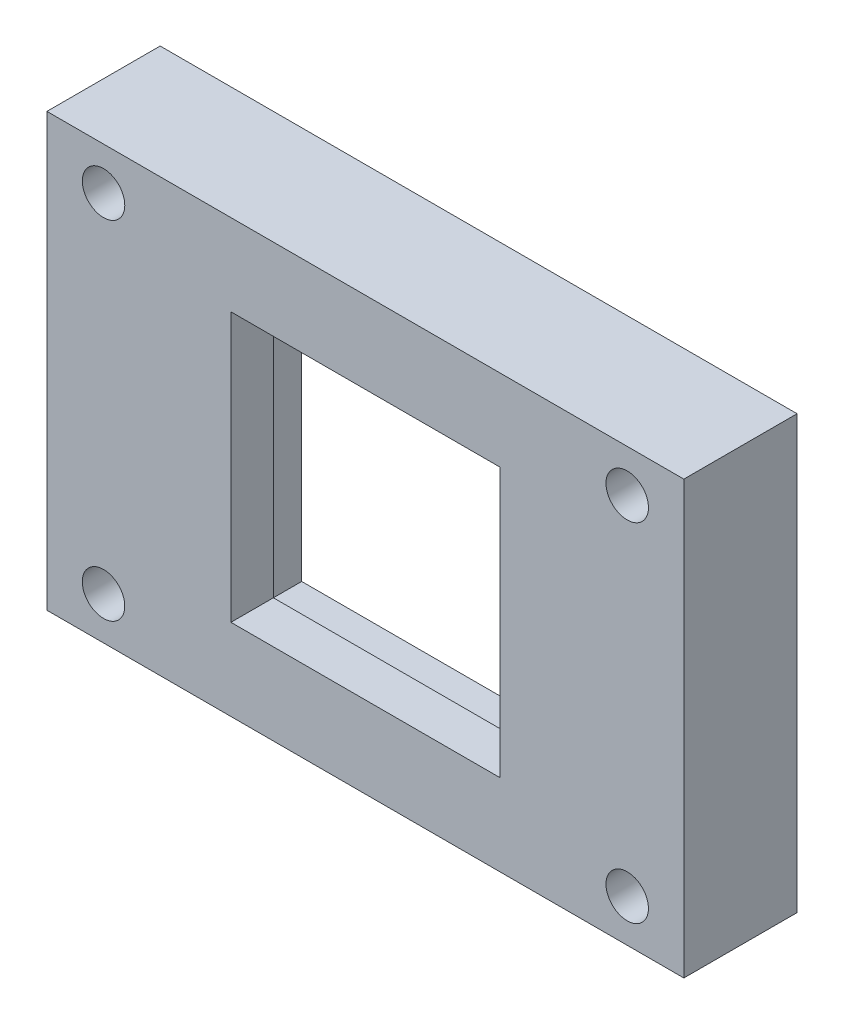
ISO-10303-21;
HEADER;
FILE_DESCRIPTION(('STEP AP214'),'2;1');
FILE_NAME('part.step','',(''),(''),'','','');
FILE_SCHEMA(('AUTOMOTIVE_DESIGN { 1 0 10303 214 1 1 1 1 }'));
ENDSEC;
DATA;
#1=APPLICATION_CONTEXT('core data for automotive mechanical design processes');
#2=APPLICATION_PROTOCOL_DEFINITION('international standard','automotive_design',2000,#1);
#3=PRODUCT_CONTEXT('',#1,'mechanical');
#4=PRODUCT('Part','Part','',(#3));
#5=PRODUCT_RELATED_PRODUCT_CATEGORY('part','',(#4));
#6=PRODUCT_DEFINITION_FORMATION('','',#4);
#7=PRODUCT_DEFINITION_CONTEXT('part definition',#1,'design');
#8=PRODUCT_DEFINITION('design','',#6,#7);
#9=PRODUCT_DEFINITION_SHAPE('','',#8);
#10=(LENGTH_UNIT() NAMED_UNIT(*) SI_UNIT(.MILLI.,.METRE.));
#11=(NAMED_UNIT(*) PLANE_ANGLE_UNIT() SI_UNIT($,.RADIAN.));
#12=(NAMED_UNIT(*) SI_UNIT($,.STERADIAN.) SOLID_ANGLE_UNIT());
#13=UNCERTAINTY_MEASURE_WITH_UNIT(LENGTH_MEASURE(1.E-05),#10,'distance_accuracy_value','');
#14=(GEOMETRIC_REPRESENTATION_CONTEXT(3) GLOBAL_UNCERTAINTY_ASSIGNED_CONTEXT((#13)) GLOBAL_UNIT_ASSIGNED_CONTEXT((#10,
#11,#12)) REPRESENTATION_CONTEXT('',''));
#15=CARTESIAN_POINT('',(0.,0.,0.));
#16=DIRECTION('',(0.,0.,1.));
#17=DIRECTION('',(1.,0.,0.));
#18=AXIS2_PLACEMENT_3D('',#15,#16,#17);
#19=CARTESIAN_POINT('',(35.,27.7635926596247,10.));
#20=DIRECTION('',(0.,-1.,0.));
#21=DIRECTION('',(0.,0.,-1.));
#22=AXIS2_PLACEMENT_3D('',#19,#20,#21);
#23=PLANE('',#22);
#24=DIRECTION('',(0.,0.,-1.));
#25=VECTOR('',#24,1.);
#26=CARTESIAN_POINT('',(35.,27.7635926596247,10.));
#27=LINE('',#26,#25);
#28=CARTESIAN_POINT('',(35.,27.7635926596247,5.));
#29=VERTEX_POINT('',#28);
#30=CARTESIAN_POINT('',(35.,27.7635926596247,0.));
#31=VERTEX_POINT('',#30);
#32=EDGE_CURVE('E159',#29,#31,#27,.T.);
#33=ORIENTED_EDGE('',*,*,#32,.F.);
#34=DIRECTION('',(-1.,0.,0.));
#35=VECTOR('',#34,1.);
#36=CARTESIAN_POINT('',(13.,27.7635926596247,5.));
#37=LINE('',#36,#35);
#38=CARTESIAN_POINT('',(10.,27.7635926596247,5.));
#39=VERTEX_POINT('',#38);
#40=EDGE_CURVE('E173',#29,#39,#37,.T.);
#41=ORIENTED_EDGE('',*,*,#40,.T.);
#42=DIRECTION('',(0.,0.,-1.));
#43=VECTOR('',#42,1.);
#44=CARTESIAN_POINT('',(10.,27.7635926596247,10.));
#45=LINE('',#44,#43);
#46=CARTESIAN_POINT('',(10.,27.7635926596247,0.));
#47=VERTEX_POINT('',#46);
#48=EDGE_CURVE('E153',#39,#47,#45,.T.);
#49=ORIENTED_EDGE('',*,*,#48,.T.);
#50=DIRECTION('',(-1.,0.,0.));
#51=VECTOR('',#50,1.);
#52=CARTESIAN_POINT('',(35.,27.7635926596247,0.));
#53=LINE('',#52,#51);
#54=EDGE_CURVE('E170',#31,#47,#53,.T.);
#55=ORIENTED_EDGE('',*,*,#54,.F.);
#56=EDGE_LOOP('',(#33,#41,#49,#55));
#57=FACE_BOUND('',#56,.T.);
#58=ADVANCED_FACE('F33',(#57),#23,.T.);
#59=CARTESIAN_POINT('',(10.,2.76359265962468,10.));
#60=DIRECTION('',(0.,1.,0.));
#61=DIRECTION('',(0.,0.,1.));
#62=AXIS2_PLACEMENT_3D('',#59,#60,#61);
#63=PLANE('',#62);
#64=DIRECTION('',(-1.,0.,0.));
#65=VECTOR('',#64,1.);
#66=CARTESIAN_POINT('',(13.,2.76359265962468,5.));
#67=LINE('',#66,#65);
#68=CARTESIAN_POINT('',(35.,2.76359265962468,5.));
#69=VERTEX_POINT('',#68);
#70=CARTESIAN_POINT('',(10.,2.76359265962468,5.));
#71=VERTEX_POINT('',#70);
#72=EDGE_CURVE('E175',#69,#71,#67,.T.);
#73=ORIENTED_EDGE('',*,*,#72,.F.);
#74=DIRECTION('',(0.,0.,-1.));
#75=VECTOR('',#74,1.);
#76=CARTESIAN_POINT('',(35.,2.76359265962468,10.));
#77=LINE('',#76,#75);
#78=CARTESIAN_POINT('',(35.,2.76359265962468,0.));
#79=VERTEX_POINT('',#78);
#80=EDGE_CURVE('E157',#69,#79,#77,.T.);
#81=ORIENTED_EDGE('',*,*,#80,.T.);
#82=DIRECTION('',(1.,0.,0.));
#83=VECTOR('',#82,1.);
#84=CARTESIAN_POINT('',(10.,2.76359265962468,0.));
#85=LINE('',#84,#83);
#86=CARTESIAN_POINT('',(10.,2.76359265962468,0.));
#87=VERTEX_POINT('',#86);
#88=EDGE_CURVE('E164',#87,#79,#85,.T.);
#89=ORIENTED_EDGE('',*,*,#88,.F.);
#90=DIRECTION('',(0.,0.,-1.));
#91=VECTOR('',#90,1.);
#92=CARTESIAN_POINT('',(10.,2.76359265962468,10.));
#93=LINE('',#92,#91);
#94=EDGE_CURVE('E155',#71,#87,#93,.T.);
#95=ORIENTED_EDGE('',*,*,#94,.F.);
#96=EDGE_LOOP('',(#73,#81,#89,#95));
#97=FACE_BOUND('',#96,.T.);
#98=ADVANCED_FACE('F279',(#97),#63,.T.);
#99=CARTESIAN_POINT('',(35.,2.76359265962468,10.));
#100=DIRECTION('',(-1.,0.,0.));
#101=DIRECTION('',(0.,-1.,0.));
#102=AXIS2_PLACEMENT_3D('',#99,#100,#101);
#103=PLANE('',#102);
#104=ORIENTED_EDGE('',*,*,#80,.F.);
#105=DIRECTION('',(0.,-1.,0.));
#106=VECTOR('',#105,1.);
#107=CARTESIAN_POINT('',(35.,0.,5.));
#108=LINE('',#107,#106);
#109=EDGE_CURVE('E184',#29,#69,#108,.T.);
#110=ORIENTED_EDGE('',*,*,#109,.F.);
#111=ORIENTED_EDGE('',*,*,#32,.T.);
#112=DIRECTION('',(0.,1.,0.));
#113=VECTOR('',#112,1.);
#114=CARTESIAN_POINT('',(35.,2.76359265962468,0.));
#115=LINE('',#114,#113);
#116=EDGE_CURVE('E161',#79,#31,#115,.T.);
#117=ORIENTED_EDGE('',*,*,#116,.F.);
#118=EDGE_LOOP('',(#104,#110,#111,#117));
#119=FACE_BOUND('',#118,.T.);
#120=ADVANCED_FACE('F261',(#119),#103,.T.);
#121=CARTESIAN_POINT('',(0.,0.,0.));
#122=DIRECTION('',(0.,0.,1.));
#123=DIRECTION('',(1.,0.,0.));
#124=AXIS2_PLACEMENT_3D('',#121,#122,#123);
#125=PLANE('',#124);
#126=CARTESIAN_POINT('',(4.,3.00000000000001,0.));
#127=DIRECTION('',(0.,0.,1.));
#128=DIRECTION('',(-1.,0.,0.));
#129=AXIS2_PLACEMENT_3D('',#126,#127,#128);
#130=CIRCLE('',#129,1.5);
#131=CARTESIAN_POINT('',(2.5,3.00000000000001,0.));
#132=VERTEX_POINT('',#131);
#133=EDGE_CURVE('E209',#132,#132,#130,.T.);
#134=ORIENTED_EDGE('',*,*,#133,.T.);
#135=EDGE_LOOP('',(#134));
#136=FACE_BOUND('',#135,.T.);
#137=CARTESIAN_POINT('',(41.,3.,0.));
#138=DIRECTION('',(0.,0.,1.));
#139=DIRECTION('',(-1.,0.,0.));
#140=AXIS2_PLACEMENT_3D('',#137,#138,#139);
#141=CIRCLE('',#140,1.5);
#142=CARTESIAN_POINT('',(39.5,3.,0.));
#143=VERTEX_POINT('',#142);
#144=EDGE_CURVE('E212',#143,#143,#141,.T.);
#145=ORIENTED_EDGE('',*,*,#144,.T.);
#146=EDGE_LOOP('',(#145));
#147=FACE_BOUND('',#146,.T.);
#148=CARTESIAN_POINT('',(41.,27.5271853192494,0.));
#149=DIRECTION('',(0.,0.,1.));
#150=DIRECTION('',(1.,0.,0.));
#151=AXIS2_PLACEMENT_3D('',#148,#149,#150);
#152=CIRCLE('',#151,1.5);
#153=CARTESIAN_POINT('',(42.5,27.5271853192494,0.));
#154=VERTEX_POINT('',#153);
#155=EDGE_CURVE('E208',#154,#154,#152,.T.);
#156=ORIENTED_EDGE('',*,*,#155,.T.);
#157=EDGE_LOOP('',(#156));
#158=FACE_BOUND('',#157,.T.);
#159=CARTESIAN_POINT('',(4.,27.5271853192494,0.));
#160=DIRECTION('',(0.,0.,1.));
#161=DIRECTION('',(1.,0.,0.));
#162=AXIS2_PLACEMENT_3D('',#159,#160,#161);
#163=CIRCLE('',#162,1.5);
#164=CARTESIAN_POINT('',(5.5,27.5271853192494,0.));
#165=VERTEX_POINT('',#164);
#166=EDGE_CURVE('E205',#165,#165,#163,.T.);
#167=ORIENTED_EDGE('',*,*,#166,.T.);
#168=EDGE_LOOP('',(#167));
#169=FACE_BOUND('',#168,.T.);
#170=DIRECTION('',(-1.,0.,0.));
#171=VECTOR('',#170,1.);
#172=CARTESIAN_POINT('',(45.0000000000001,30.5271853192494,0.));
#173=LINE('',#172,#171);
#174=CARTESIAN_POINT('',(45.0000000000001,30.5271853192494,0.));
#175=VERTEX_POINT('',#174);
#176=CARTESIAN_POINT('',(0.,30.5271853192494,0.));
#177=VERTEX_POINT('',#176);
#178=EDGE_CURVE('E150',#175,#177,#173,.T.);
#179=ORIENTED_EDGE('',*,*,#178,.F.);
#180=DIRECTION('',(0.,1.,0.));
#181=VECTOR('',#180,1.);
#182=CARTESIAN_POINT('',(45.0000000000001,0.,0.));
#183=LINE('',#182,#181);
#184=CARTESIAN_POINT('',(45.0000000000001,0.,0.));
#185=VERTEX_POINT('',#184);
#186=EDGE_CURVE('E144',#185,#175,#183,.T.);
#187=ORIENTED_EDGE('',*,*,#186,.F.);
#188=DIRECTION('',(1.,0.,0.));
#189=VECTOR('',#188,1.);
#190=CARTESIAN_POINT('',(0.,0.,0.));
#191=LINE('',#190,#189);
#192=CARTESIAN_POINT('',(0.,0.,0.));
#193=VERTEX_POINT('',#192);
#194=EDGE_CURVE('E147',#193,#185,#191,.T.);
#195=ORIENTED_EDGE('',*,*,#194,.F.);
#196=DIRECTION('',(0.,-1.,0.));
#197=VECTOR('',#196,1.);
#198=CARTESIAN_POINT('',(0.,30.5271853192494,0.));
#199=LINE('',#198,#197);
#200=EDGE_CURVE('E137',#177,#193,#199,.T.);
#201=ORIENTED_EDGE('',*,*,#200,.F.);
#202=EDGE_LOOP('',(#179,#187,#195,#201));
#203=FACE_BOUND('',#202,.T.);
#204=ORIENTED_EDGE('',*,*,#54,.T.);
#205=DIRECTION('',(0.,-1.,0.));
#206=VECTOR('',#205,1.);
#207=CARTESIAN_POINT('',(10.,27.7635926596247,0.));
#208=LINE('',#207,#206);
#209=EDGE_CURVE('E167',#47,#87,#208,.T.);
#210=ORIENTED_EDGE('',*,*,#209,.T.);
#211=ORIENTED_EDGE('',*,*,#88,.T.);
#212=ORIENTED_EDGE('',*,*,#116,.T.);
#213=EDGE_LOOP('',(#204,#210,#211,#212));
#214=FACE_BOUND('',#213,.T.);
#215=ADVANCED_FACE('F258',(#136,#147,#158,#169,#203,#214),#125,.F.);
#216=CARTESIAN_POINT('',(45.0000000000001,30.5271853192494,10.));
#217=DIRECTION('',(0.,-1.,0.));
#218=DIRECTION('',(1.,0.,0.));
#219=AXIS2_PLACEMENT_3D('',#216,#217,#218);
#220=PLANE('',#219);
#221=DIRECTION('',(0.,0.,-1.));
#222=VECTOR('',#221,1.);
#223=CARTESIAN_POINT('',(0.,30.5271853192494,10.));
#224=LINE('',#223,#222);
#225=CARTESIAN_POINT('',(0.,30.5271853192494,8.));
#226=VERTEX_POINT('',#225);
#227=EDGE_CURVE('E11',#226,#177,#224,.T.);
#228=ORIENTED_EDGE('',*,*,#227,.F.);
#229=DIRECTION('',(1.,0.,0.));
#230=VECTOR('',#229,1.);
#231=CARTESIAN_POINT('',(0.,30.5271853192494,8.));
#232=LINE('',#231,#230);
#233=CARTESIAN_POINT('',(45.0000000000001,30.5271853192494,8.));
#234=VERTEX_POINT('',#233);
#235=EDGE_CURVE('E123',#226,#234,#232,.T.);
#236=ORIENTED_EDGE('',*,*,#235,.T.);
#237=DIRECTION('',(0.,0.,-1.));
#238=VECTOR('',#237,1.);
#239=CARTESIAN_POINT('',(45.0000000000001,30.5271853192494,10.));
#240=LINE('',#239,#238);
#241=EDGE_CURVE('E140',#234,#175,#240,.T.);
#242=ORIENTED_EDGE('',*,*,#241,.T.);
#243=ORIENTED_EDGE('',*,*,#178,.T.);
#244=EDGE_LOOP('',(#228,#236,#242,#243));
#245=FACE_BOUND('',#244,.T.);
#246=ADVANCED_FACE('F35',(#245),#220,.F.);
#247=CARTESIAN_POINT('',(0.,30.5271853192494,10.));
#248=DIRECTION('',(1.,0.,0.));
#249=DIRECTION('',(0.,0.,-1.));
#250=AXIS2_PLACEMENT_3D('',#247,#248,#249);
#251=PLANE('',#250);
#252=DIRECTION('',(0.,0.,-1.));
#253=VECTOR('',#252,1.);
#254=CARTESIAN_POINT('',(0.,0.,10.));
#255=LINE('',#254,#253);
#256=CARTESIAN_POINT('',(0.,0.,8.));
#257=VERTEX_POINT('',#256);
#258=EDGE_CURVE('E42',#257,#193,#255,.T.);
#259=ORIENTED_EDGE('',*,*,#258,.F.);
#260=DIRECTION('',(0.,1.,0.));
#261=VECTOR('',#260,1.);
#262=CARTESIAN_POINT('',(0.,0.,8.));
#263=LINE('',#262,#261);
#264=EDGE_CURVE('E120',#257,#226,#263,.T.);
#265=ORIENTED_EDGE('',*,*,#264,.T.);
#266=ORIENTED_EDGE('',*,*,#227,.T.);
#267=ORIENTED_EDGE('',*,*,#200,.T.);
#268=EDGE_LOOP('',(#259,#265,#266,#267));
#269=FACE_BOUND('',#268,.T.);
#270=ADVANCED_FACE('F135',(#269),#251,.F.);
#271=CARTESIAN_POINT('',(0.,0.,10.));
#272=DIRECTION('',(0.,1.,0.));
#273=DIRECTION('',(0.,0.,1.));
#274=AXIS2_PLACEMENT_3D('',#271,#272,#273);
#275=PLANE('',#274);
#276=DIRECTION('',(0.,0.,-1.));
#277=VECTOR('',#276,1.);
#278=CARTESIAN_POINT('',(45.0000000000001,0.,10.));
#279=LINE('',#278,#277);
#280=CARTESIAN_POINT('',(45.0000000000001,0.,8.));
#281=VERTEX_POINT('',#280);
#282=EDGE_CURVE('E133',#281,#185,#279,.T.);
#283=ORIENTED_EDGE('',*,*,#282,.F.);
#284=DIRECTION('',(1.,0.,0.));
#285=VECTOR('',#284,1.);
#286=CARTESIAN_POINT('',(0.,0.,8.));
#287=LINE('',#286,#285);
#288=EDGE_CURVE('E49',#257,#281,#287,.T.);
#289=ORIENTED_EDGE('',*,*,#288,.F.);
#290=ORIENTED_EDGE('',*,*,#258,.T.);
#291=ORIENTED_EDGE('',*,*,#194,.T.);
#292=EDGE_LOOP('',(#283,#289,#290,#291));
#293=FACE_BOUND('',#292,.T.);
#294=ADVANCED_FACE('F130',(#293),#275,.F.);
#295=CARTESIAN_POINT('',(45.0000000000001,0.,10.));
#296=DIRECTION('',(-1.,0.,0.));
#297=DIRECTION('',(0.,-1.,0.));
#298=AXIS2_PLACEMENT_3D('',#295,#296,#297);
#299=PLANE('',#298);
#300=ORIENTED_EDGE('',*,*,#241,.F.);
#301=DIRECTION('',(0.,-1.,0.));
#302=VECTOR('',#301,1.);
#303=CARTESIAN_POINT('',(45.0000000000001,0.,8.));
#304=LINE('',#303,#302);
#305=EDGE_CURVE('E213',#234,#281,#304,.T.);
#306=ORIENTED_EDGE('',*,*,#305,.T.);
#307=ORIENTED_EDGE('',*,*,#282,.T.);
#308=ORIENTED_EDGE('',*,*,#186,.T.);
#309=EDGE_LOOP('',(#300,#306,#307,#308));
#310=FACE_BOUND('',#309,.T.);
#311=ADVANCED_FACE('F325',(#310),#299,.F.);
#312=CARTESIAN_POINT('',(10.,27.7635926596247,10.));
#313=DIRECTION('',(1.,0.,0.));
#314=DIRECTION('',(0.,0.,-1.));
#315=AXIS2_PLACEMENT_3D('',#312,#313,#314);
#316=PLANE('',#315);
#317=DIRECTION('',(0.,-1.,0.));
#318=VECTOR('',#317,1.);
#319=CARTESIAN_POINT('',(10.,0.,4.99999999999999));
#320=LINE('',#319,#318);
#321=EDGE_CURVE('E179',#39,#71,#320,.T.);
#322=ORIENTED_EDGE('',*,*,#321,.T.);
#323=ORIENTED_EDGE('',*,*,#94,.T.);
#324=ORIENTED_EDGE('',*,*,#209,.F.);
#325=ORIENTED_EDGE('',*,*,#48,.F.);
#326=EDGE_LOOP('',(#322,#323,#324,#325));
#327=FACE_BOUND('',#326,.T.);
#328=ADVANCED_FACE('F275',(#327),#316,.T.);
#329=CARTESIAN_POINT('',(13.,0.,4.99999999999999));
#330=DIRECTION('',(0.,0.,-1.));
#331=DIRECTION('',(0.,1.,0.));
#332=AXIS2_PLACEMENT_3D('',#329,#330,#331);
#333=PLANE('',#332);
#334=ORIENTED_EDGE('',*,*,#109,.T.);
#335=ORIENTED_EDGE('',*,*,#72,.T.);
#336=ORIENTED_EDGE('',*,*,#321,.F.);
#337=ORIENTED_EDGE('',*,*,#40,.F.);
#338=EDGE_LOOP('',(#334,#335,#336,#337));
#339=FACE_BOUND('',#338,.T.);
#340=DIRECTION('',(0.,-1.,0.));
#341=VECTOR('',#340,1.);
#342=CARTESIAN_POINT('',(13.,0.,4.99999999999999));
#343=LINE('',#342,#341);
#344=CARTESIAN_POINT('',(13.,24.7635926596247,5.));
#345=VERTEX_POINT('',#344);
#346=CARTESIAN_POINT('',(13.,5.76359265962468,5.));
#347=VERTEX_POINT('',#346);
#348=EDGE_CURVE('E178',#345,#347,#343,.T.);
#349=ORIENTED_EDGE('',*,*,#348,.T.);
#350=DIRECTION('',(1.,0.,0.));
#351=VECTOR('',#350,1.);
#352=CARTESIAN_POINT('',(0.,5.76359265962468,5.));
#353=LINE('',#352,#351);
#354=CARTESIAN_POINT('',(32.,5.76359265962468,5.));
#355=VERTEX_POINT('',#354);
#356=EDGE_CURVE('E202',#347,#355,#353,.T.);
#357=ORIENTED_EDGE('',*,*,#356,.T.);
#358=DIRECTION('',(0.,-1.,0.));
#359=VECTOR('',#358,1.);
#360=CARTESIAN_POINT('',(32.,0.,5.));
#361=LINE('',#360,#359);
#362=CARTESIAN_POINT('',(32.,24.7635926596247,5.));
#363=VERTEX_POINT('',#362);
#364=EDGE_CURVE('E181',#363,#355,#361,.T.);
#365=ORIENTED_EDGE('',*,*,#364,.F.);
#366=DIRECTION('',(1.,0.,0.));
#367=VECTOR('',#366,1.);
#368=CARTESIAN_POINT('',(0.,24.7635926596247,5.));
#369=LINE('',#368,#367);
#370=EDGE_CURVE('E192',#345,#363,#369,.T.);
#371=ORIENTED_EDGE('',*,*,#370,.F.);
#372=EDGE_LOOP('',(#349,#357,#365,#371));
#373=FACE_BOUND('',#372,.T.);
#374=ADVANCED_FACE('F284',(#339,#373),#333,.T.);
#375=CARTESIAN_POINT('',(13.,0.,0.));
#376=DIRECTION('',(1.,0.,0.));
#377=DIRECTION('',(0.,0.,-1.));
#378=AXIS2_PLACEMENT_3D('',#375,#376,#377);
#379=PLANE('',#378);
#380=DIRECTION('',(0.,1.,0.));
#381=VECTOR('',#380,1.);
#382=CARTESIAN_POINT('',(13.,0.,8.));
#383=LINE('',#382,#381);
#384=CARTESIAN_POINT('',(13.,5.76359265962468,8.));
#385=VERTEX_POINT('',#384);
#386=CARTESIAN_POINT('',(13.,24.7635926596247,8.));
#387=VERTEX_POINT('',#386);
#388=EDGE_CURVE('E221',#385,#387,#383,.T.);
#389=ORIENTED_EDGE('',*,*,#388,.F.);
#390=DIRECTION('',(0.,0.,1.));
#391=VECTOR('',#390,1.);
#392=CARTESIAN_POINT('',(13.,5.76359265962468,0.));
#393=LINE('',#392,#391);
#394=EDGE_CURVE('E199',#347,#385,#393,.T.);
#395=ORIENTED_EDGE('',*,*,#394,.F.);
#396=ORIENTED_EDGE('',*,*,#348,.F.);
#397=DIRECTION('',(0.,0.,-1.));
#398=VECTOR('',#397,1.);
#399=CARTESIAN_POINT('',(13.,24.7635926596247,0.));
#400=LINE('',#399,#398);
#401=EDGE_CURVE('E195',#387,#345,#400,.T.);
#402=ORIENTED_EDGE('',*,*,#401,.F.);
#403=EDGE_LOOP('',(#389,#395,#396,#402));
#404=FACE_BOUND('',#403,.T.);
#405=ADVANCED_FACE('F287',(#404),#379,.T.);
#406=CARTESIAN_POINT('',(32.,0.,0.));
#407=DIRECTION('',(-1.,0.,0.));
#408=DIRECTION('',(0.,-1.,0.));
#409=AXIS2_PLACEMENT_3D('',#406,#407,#408);
#410=PLANE('',#409);
#411=DIRECTION('',(0.,-1.,0.));
#412=VECTOR('',#411,1.);
#413=CARTESIAN_POINT('',(32.,0.,8.));
#414=LINE('',#413,#412);
#415=CARTESIAN_POINT('',(32.,24.7635926596247,8.));
#416=VERTEX_POINT('',#415);
#417=CARTESIAN_POINT('',(32.,5.76359265962468,8.));
#418=VERTEX_POINT('',#417);
#419=EDGE_CURVE('E57',#416,#418,#414,.T.);
#420=ORIENTED_EDGE('',*,*,#419,.F.);
#421=DIRECTION('',(0.,0.,1.));
#422=VECTOR('',#421,1.);
#423=CARTESIAN_POINT('',(32.,24.7635926596247,0.));
#424=LINE('',#423,#422);
#425=EDGE_CURVE('E187',#363,#416,#424,.T.);
#426=ORIENTED_EDGE('',*,*,#425,.F.);
#427=ORIENTED_EDGE('',*,*,#364,.T.);
#428=DIRECTION('',(0.,0.,-1.));
#429=VECTOR('',#428,1.);
#430=CARTESIAN_POINT('',(32.,5.76359265962468,0.));
#431=LINE('',#430,#429);
#432=EDGE_CURVE('E197',#418,#355,#431,.T.);
#433=ORIENTED_EDGE('',*,*,#432,.F.);
#434=EDGE_LOOP('',(#420,#426,#427,#433));
#435=FACE_BOUND('',#434,.T.);
#436=ADVANCED_FACE('F298',(#435),#410,.T.);
#437=CARTESIAN_POINT('',(0.,24.7635926596247,0.));
#438=DIRECTION('',(0.,-1.,0.));
#439=DIRECTION('',(0.,0.,-1.));
#440=AXIS2_PLACEMENT_3D('',#437,#438,#439);
#441=PLANE('',#440);
#442=DIRECTION('',(1.,0.,0.));
#443=VECTOR('',#442,1.);
#444=CARTESIAN_POINT('',(0.,24.7635926596247,8.));
#445=LINE('',#444,#443);
#446=EDGE_CURVE('E219',#387,#416,#445,.T.);
#447=ORIENTED_EDGE('',*,*,#446,.F.);
#448=ORIENTED_EDGE('',*,*,#401,.T.);
#449=ORIENTED_EDGE('',*,*,#370,.T.);
#450=ORIENTED_EDGE('',*,*,#425,.T.);
#451=EDGE_LOOP('',(#447,#448,#449,#450));
#452=FACE_BOUND('',#451,.T.);
#453=ADVANCED_FACE('F301',(#452),#441,.T.);
#454=CARTESIAN_POINT('',(0.,5.76359265962468,0.));
#455=DIRECTION('',(0.,1.,0.));
#456=DIRECTION('',(0.,0.,1.));
#457=AXIS2_PLACEMENT_3D('',#454,#455,#456);
#458=PLANE('',#457);
#459=DIRECTION('',(-1.,0.,0.));
#460=VECTOR('',#459,1.);
#461=CARTESIAN_POINT('',(0.,5.76359265962468,8.));
#462=LINE('',#461,#460);
#463=EDGE_CURVE('E224',#418,#385,#462,.T.);
#464=ORIENTED_EDGE('',*,*,#463,.F.);
#465=ORIENTED_EDGE('',*,*,#432,.T.);
#466=ORIENTED_EDGE('',*,*,#356,.F.);
#467=ORIENTED_EDGE('',*,*,#394,.T.);
#468=EDGE_LOOP('',(#464,#465,#466,#467));
#469=FACE_BOUND('',#468,.T.);
#470=ADVANCED_FACE('F254',(#469),#458,.T.);
#471=CARTESIAN_POINT('',(4.,27.5271853192494,0.));
#472=DIRECTION('',(0.,0.,1.));
#473=DIRECTION('',(1.,0.,0.));
#474=AXIS2_PLACEMENT_3D('',#471,#472,#473);
#475=CYLINDRICAL_SURFACE('',#474,1.5);
#476=CARTESIAN_POINT('',(4.,27.5271853192494,8.));
#477=DIRECTION('',(0.,0.,-1.));
#478=DIRECTION('',(-1.,0.,0.));
#479=AXIS2_PLACEMENT_3D('',#476,#477,#478);
#480=CIRCLE('',#479,1.5);
#481=CARTESIAN_POINT('',(2.5,27.5271853192494,8.));
#482=VERTEX_POINT('',#481);
#483=EDGE_CURVE('E226',#482,#482,#480,.F.);
#484=ORIENTED_EDGE('',*,*,#483,.T.);
#485=EDGE_LOOP('',(#484));
#486=FACE_BOUND('',#485,.T.);
#487=ORIENTED_EDGE('',*,*,#166,.F.);
#488=EDGE_LOOP('',(#487));
#489=FACE_BOUND('',#488,.T.);
#490=ADVANCED_FACE('F250',(#486,#489),#475,.F.);
#491=CARTESIAN_POINT('',(41.,27.5271853192494,0.));
#492=DIRECTION('',(0.,0.,1.));
#493=DIRECTION('',(1.,0.,0.));
#494=AXIS2_PLACEMENT_3D('',#491,#492,#493);
#495=CYLINDRICAL_SURFACE('',#494,1.5);
#496=CARTESIAN_POINT('',(41.,27.5271853192494,8.));
#497=DIRECTION('',(0.,0.,-1.));
#498=DIRECTION('',(-1.,0.,0.));
#499=AXIS2_PLACEMENT_3D('',#496,#497,#498);
#500=CIRCLE('',#499,1.5);
#501=CARTESIAN_POINT('',(39.5,27.5271853192494,8.));
#502=VERTEX_POINT('',#501);
#503=EDGE_CURVE('E229',#502,#502,#500,.F.);
#504=ORIENTED_EDGE('',*,*,#503,.T.);
#505=EDGE_LOOP('',(#504));
#506=FACE_BOUND('',#505,.T.);
#507=ORIENTED_EDGE('',*,*,#155,.F.);
#508=EDGE_LOOP('',(#507));
#509=FACE_BOUND('',#508,.T.);
#510=ADVANCED_FACE('F253',(#506,#509),#495,.F.);
#511=CARTESIAN_POINT('',(41.,3.,0.));
#512=DIRECTION('',(0.,0.,1.));
#513=DIRECTION('',(1.,0.,0.));
#514=AXIS2_PLACEMENT_3D('',#511,#512,#513);
#515=CYLINDRICAL_SURFACE('',#514,1.5);
#516=CARTESIAN_POINT('',(41.,3.,8.));
#517=DIRECTION('',(0.,0.,-1.));
#518=DIRECTION('',(-1.,0.,0.));
#519=AXIS2_PLACEMENT_3D('',#516,#517,#518);
#520=CIRCLE('',#519,1.5);
#521=CARTESIAN_POINT('',(39.5,3.,8.));
#522=VERTEX_POINT('',#521);
#523=EDGE_CURVE('E232',#522,#522,#520,.F.);
#524=ORIENTED_EDGE('',*,*,#523,.T.);
#525=EDGE_LOOP('',(#524));
#526=FACE_BOUND('',#525,.T.);
#527=ORIENTED_EDGE('',*,*,#144,.F.);
#528=EDGE_LOOP('',(#527));
#529=FACE_BOUND('',#528,.T.);
#530=ADVANCED_FACE('F308',(#526,#529),#515,.F.);
#531=CARTESIAN_POINT('',(4.,3.00000000000001,0.));
#532=DIRECTION('',(0.,0.,1.));
#533=DIRECTION('',(1.,0.,0.));
#534=AXIS2_PLACEMENT_3D('',#531,#532,#533);
#535=CYLINDRICAL_SURFACE('',#534,1.5);
#536=CARTESIAN_POINT('',(4.,3.00000000000001,8.));
#537=DIRECTION('',(0.,0.,-1.));
#538=DIRECTION('',(-1.,0.,0.));
#539=AXIS2_PLACEMENT_3D('',#536,#537,#538);
#540=CIRCLE('',#539,1.5);
#541=CARTESIAN_POINT('',(2.5,3.00000000000001,8.));
#542=VERTEX_POINT('',#541);
#543=EDGE_CURVE('E37',#542,#542,#540,.F.);
#544=ORIENTED_EDGE('',*,*,#543,.T.);
#545=EDGE_LOOP('',(#544));
#546=FACE_BOUND('',#545,.T.);
#547=ORIENTED_EDGE('',*,*,#133,.F.);
#548=EDGE_LOOP('',(#547));
#549=FACE_BOUND('',#548,.T.);
#550=ADVANCED_FACE('F240',(#546,#549),#535,.F.);
#551=CARTESIAN_POINT('',(0.,0.,8.));
#552=DIRECTION('',(0.,0.,-1.));
#553=DIRECTION('',(-1.,0.,0.));
#554=AXIS2_PLACEMENT_3D('',#551,#552,#553);
#555=PLANE('',#554);
#556=ORIENTED_EDGE('',*,*,#446,.T.);
#557=ORIENTED_EDGE('',*,*,#419,.T.);
#558=ORIENTED_EDGE('',*,*,#463,.T.);
#559=ORIENTED_EDGE('',*,*,#388,.T.);
#560=EDGE_LOOP('',(#556,#557,#558,#559));
#561=FACE_BOUND('',#560,.T.);
#562=ORIENTED_EDGE('',*,*,#503,.F.);
#563=EDGE_LOOP('',(#562));
#564=FACE_BOUND('',#563,.T.);
#565=ORIENTED_EDGE('',*,*,#543,.F.);
#566=EDGE_LOOP('',(#565));
#567=FACE_BOUND('',#566,.T.);
#568=ORIENTED_EDGE('',*,*,#523,.F.);
#569=EDGE_LOOP('',(#568));
#570=FACE_BOUND('',#569,.T.);
#571=ORIENTED_EDGE('',*,*,#483,.F.);
#572=EDGE_LOOP('',(#571));
#573=FACE_BOUND('',#572,.T.);
#574=ORIENTED_EDGE('',*,*,#235,.F.);
#575=ORIENTED_EDGE('',*,*,#264,.F.);
#576=ORIENTED_EDGE('',*,*,#288,.T.);
#577=ORIENTED_EDGE('',*,*,#305,.F.);
#578=EDGE_LOOP('',(#574,#575,#576,#577));
#579=FACE_BOUND('',#578,.T.);
#580=ADVANCED_FACE('F121',(#561,#564,#567,#570,#573,#579),#555,.F.);
#581=CLOSED_SHELL('',(#58,#98,#120,#215,#246,#270,#294,#311,#328,#374,#405,#436,#453,#470,#490,
#510,#530,#550,#580));
#582=MANIFOLD_SOLID_BREP('B2',#581);
#583=ADVANCED_BREP_SHAPE_REPRESENTATION('',(#18,#582),#14);
#584=SHAPE_DEFINITION_REPRESENTATION(#9,#583);
ENDSEC;
END-ISO-10303-21;
